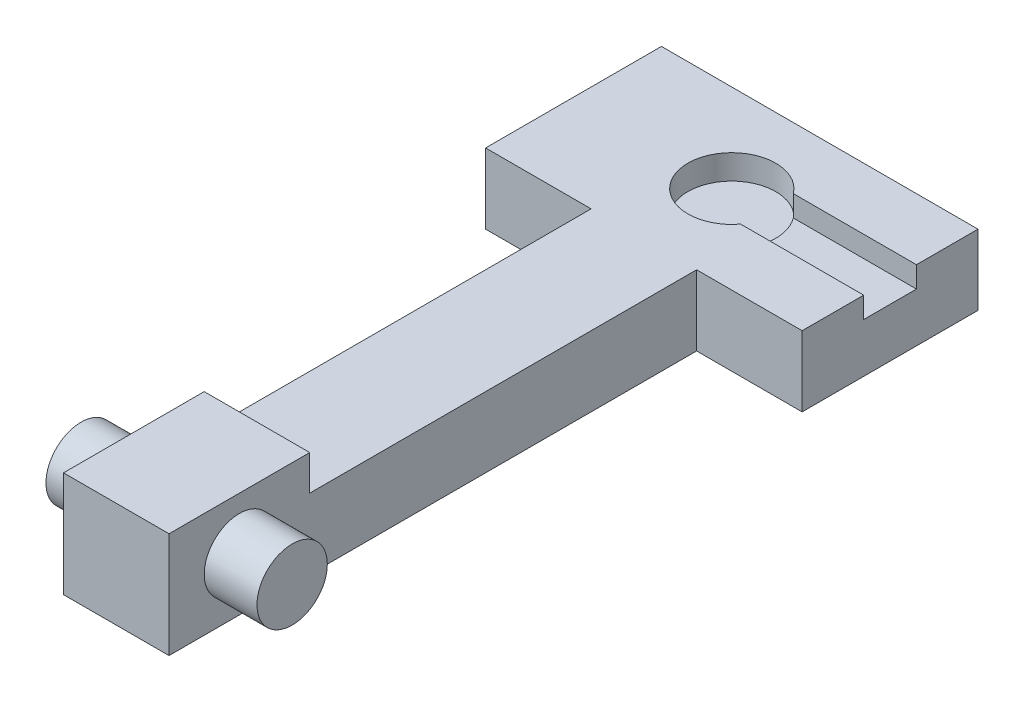
ISO-10303-21;
HEADER;
FILE_DESCRIPTION(('STEP AP214'),'2;1');
FILE_NAME('part.step','',(''),(''),'','','');
FILE_SCHEMA(('AUTOMOTIVE_DESIGN { 1 0 10303 214 1 1 1 1 }'));
ENDSEC;
DATA;
#1=APPLICATION_CONTEXT('core data for automotive mechanical design processes');
#2=APPLICATION_PROTOCOL_DEFINITION('international standard','automotive_design',2000,#1);
#3=PRODUCT_CONTEXT('',#1,'mechanical');
#4=PRODUCT('Part','Part','',(#3));
#5=PRODUCT_RELATED_PRODUCT_CATEGORY('part','',(#4));
#6=PRODUCT_DEFINITION_FORMATION('','',#4);
#7=PRODUCT_DEFINITION_CONTEXT('part definition',#1,'design');
#8=PRODUCT_DEFINITION('design','',#6,#7);
#9=PRODUCT_DEFINITION_SHAPE('','',#8);
#10=(LENGTH_UNIT() NAMED_UNIT(*) SI_UNIT(.MILLI.,.METRE.));
#11=(NAMED_UNIT(*) PLANE_ANGLE_UNIT() SI_UNIT($,.RADIAN.));
#12=(NAMED_UNIT(*) SI_UNIT($,.STERADIAN.) SOLID_ANGLE_UNIT());
#13=UNCERTAINTY_MEASURE_WITH_UNIT(LENGTH_MEASURE(1.E-05),#10,'distance_accuracy_value','');
#14=(GEOMETRIC_REPRESENTATION_CONTEXT(3) GLOBAL_UNCERTAINTY_ASSIGNED_CONTEXT((#13)) GLOBAL_UNIT_ASSIGNED_CONTEXT((#10,
#11,#12)) REPRESENTATION_CONTEXT('',''));
#15=CARTESIAN_POINT('',(0.,0.,0.));
#16=DIRECTION('',(0.,0.,1.));
#17=DIRECTION('',(1.,0.,0.));
#18=AXIS2_PLACEMENT_3D('',#15,#16,#17);
#19=CARTESIAN_POINT('',(0.,20.,0.));
#20=DIRECTION('',(1.,0.,0.));
#21=DIRECTION('',(0.,0.,-1.));
#22=AXIS2_PLACEMENT_3D('',#19,#20,#21);
#23=PLANE('',#22);
#24=CARTESIAN_POINT('',(0.,15.,-20.));
#25=DIRECTION('',(1.,0.,0.));
#26=DIRECTION('',(0.,0.,-1.));
#27=AXIS2_PLACEMENT_3D('',#24,#25,#26);
#28=CIRCLE('',#27,10.);
#29=CARTESIAN_POINT('',(0.,15.,-30.));
#30=VERTEX_POINT('',#29);
#31=EDGE_CURVE('E333',#30,#30,#28,.T.);
#32=ORIENTED_EDGE('',*,*,#31,.T.);
#33=EDGE_LOOP('',(#32));
#34=FACE_BOUND('',#33,.T.);
#35=DIRECTION('',(0.,0.,1.));
#36=VECTOR('',#35,1.);
#37=CARTESIAN_POINT('',(0.,0.,0.));
#38=LINE('',#37,#36);
#39=CARTESIAN_POINT('',(0.,0.,-150.));
#40=VERTEX_POINT('',#39);
#41=CARTESIAN_POINT('',(0.,0.,0.));
#42=VERTEX_POINT('',#41);
#43=EDGE_CURVE('E205',#40,#42,#38,.T.);
#44=ORIENTED_EDGE('',*,*,#43,.T.);
#45=DIRECTION('',(0.,-1.,0.));
#46=VECTOR('',#45,1.);
#47=CARTESIAN_POINT('',(0.,20.,0.));
#48=LINE('',#47,#46);
#49=CARTESIAN_POINT('',(0.,30.,0.));
#50=VERTEX_POINT('',#49);
#51=EDGE_CURVE('E282',#50,#42,#48,.T.);
#52=ORIENTED_EDGE('',*,*,#51,.F.);
#53=DIRECTION('',(0.,0.,1.));
#54=VECTOR('',#53,1.);
#55=CARTESIAN_POINT('',(0.,30.,0.));
#56=LINE('',#55,#54);
#57=CARTESIAN_POINT('',(0.,30.,-40.));
#58=VERTEX_POINT('',#57);
#59=EDGE_CURVE('E158',#58,#50,#56,.T.);
#60=ORIENTED_EDGE('',*,*,#59,.F.);
#61=DIRECTION('',(0.,-1.,0.));
#62=VECTOR('',#61,1.);
#63=CARTESIAN_POINT('',(0.,30.,-40.));
#64=LINE('',#63,#62);
#65=CARTESIAN_POINT('',(0.,20.,-40.));
#66=VERTEX_POINT('',#65);
#67=EDGE_CURVE('E153',#58,#66,#64,.T.);
#68=ORIENTED_EDGE('',*,*,#67,.T.);
#69=DIRECTION('',(0.,0.,1.));
#70=VECTOR('',#69,1.);
#71=CARTESIAN_POINT('',(0.,20.,0.));
#72=LINE('',#71,#70);
#73=CARTESIAN_POINT('',(0.,20.,-150.));
#74=VERTEX_POINT('',#73);
#75=EDGE_CURVE('E209',#74,#66,#72,.T.);
#76=ORIENTED_EDGE('',*,*,#75,.F.);
#77=DIRECTION('',(0.,-1.,0.));
#78=VECTOR('',#77,1.);
#79=CARTESIAN_POINT('',(0.,20.,-150.));
#80=LINE('',#79,#78);
#81=EDGE_CURVE('E232',#74,#40,#80,.T.);
#82=ORIENTED_EDGE('',*,*,#81,.T.);
#83=EDGE_LOOP('',(#44,#52,#60,#68,#76,#82));
#84=FACE_BOUND('',#83,.T.);
#85=ADVANCED_FACE('F45',(#34,#84),#23,.F.);
#86=CARTESIAN_POINT('',(0.,20.,0.));
#87=DIRECTION('',(0.,0.,-1.));
#88=DIRECTION('',(-1.,0.,0.));
#89=AXIS2_PLACEMENT_3D('',#86,#87,#88);
#90=PLANE('',#89);
#91=DIRECTION('',(1.,0.,0.));
#92=VECTOR('',#91,1.);
#93=CARTESIAN_POINT('',(0.,0.,0.));
#94=LINE('',#93,#92);
#95=CARTESIAN_POINT('',(30.,0.,0.));
#96=VERTEX_POINT('',#95);
#97=EDGE_CURVE('E236',#42,#96,#94,.T.);
#98=ORIENTED_EDGE('',*,*,#97,.T.);
#99=DIRECTION('',(0.,-1.,0.));
#100=VECTOR('',#99,1.);
#101=CARTESIAN_POINT('',(30.,20.,0.));
#102=LINE('',#101,#100);
#103=CARTESIAN_POINT('',(30.,30.,0.));
#104=VERTEX_POINT('',#103);
#105=EDGE_CURVE('E279',#104,#96,#102,.T.);
#106=ORIENTED_EDGE('',*,*,#105,.F.);
#107=DIRECTION('',(1.,0.,0.));
#108=VECTOR('',#107,1.);
#109=CARTESIAN_POINT('',(30.,30.,0.));
#110=LINE('',#109,#108);
#111=EDGE_CURVE('E165',#50,#104,#110,.T.);
#112=ORIENTED_EDGE('',*,*,#111,.F.);
#113=ORIENTED_EDGE('',*,*,#51,.T.);
#114=EDGE_LOOP('',(#98,#106,#112,#113));
#115=FACE_BOUND('',#114,.T.);
#116=ADVANCED_FACE('F323',(#115),#90,.F.);
#117=CARTESIAN_POINT('',(30.,20.,0.));
#118=DIRECTION('',(-1.,0.,0.));
#119=DIRECTION('',(0.,0.,1.));
#120=AXIS2_PLACEMENT_3D('',#117,#118,#119);
#121=PLANE('',#120);
#122=CARTESIAN_POINT('',(30.,15.,-20.));
#123=DIRECTION('',(-1.,0.,0.));
#124=DIRECTION('',(0.,0.,1.));
#125=AXIS2_PLACEMENT_3D('',#122,#123,#124);
#126=CIRCLE('',#125,10.);
#127=CARTESIAN_POINT('',(30.,15.,-30.));
#128=VERTEX_POINT('',#127);
#129=EDGE_CURVE('E48',#128,#128,#126,.T.);
#130=ORIENTED_EDGE('',*,*,#129,.T.);
#131=EDGE_LOOP('',(#130));
#132=FACE_BOUND('',#131,.T.);
#133=DIRECTION('',(0.,0.,-1.));
#134=VECTOR('',#133,1.);
#135=CARTESIAN_POINT('',(30.,0.,0.));
#136=LINE('',#135,#134);
#137=CARTESIAN_POINT('',(30.,0.,-150.));
#138=VERTEX_POINT('',#137);
#139=EDGE_CURVE('E239',#96,#138,#136,.T.);
#140=ORIENTED_EDGE('',*,*,#139,.T.);
#141=DIRECTION('',(0.,-1.,0.));
#142=VECTOR('',#141,1.);
#143=CARTESIAN_POINT('',(30.,20.,-150.));
#144=LINE('',#143,#142);
#145=CARTESIAN_POINT('',(30.,20.,-150.));
#146=VERTEX_POINT('',#145);
#147=EDGE_CURVE('E275',#146,#138,#144,.T.);
#148=ORIENTED_EDGE('',*,*,#147,.F.);
#149=DIRECTION('',(0.,0.,-1.));
#150=VECTOR('',#149,1.);
#151=CARTESIAN_POINT('',(30.,20.,0.));
#152=LINE('',#151,#150);
#153=CARTESIAN_POINT('',(30.,20.,-40.));
#154=VERTEX_POINT('',#153);
#155=EDGE_CURVE('E172',#154,#146,#152,.T.);
#156=ORIENTED_EDGE('',*,*,#155,.F.);
#157=DIRECTION('',(0.,-1.,0.));
#158=VECTOR('',#157,1.);
#159=CARTESIAN_POINT('',(30.,30.,-40.));
#160=LINE('',#159,#158);
#161=CARTESIAN_POINT('',(30.,30.,-40.));
#162=VERTEX_POINT('',#161);
#163=EDGE_CURVE('E151',#162,#154,#160,.T.);
#164=ORIENTED_EDGE('',*,*,#163,.F.);
#165=DIRECTION('',(0.,0.,-1.));
#166=VECTOR('',#165,1.);
#167=CARTESIAN_POINT('',(30.,30.,0.));
#168=LINE('',#167,#166);
#169=EDGE_CURVE('E159',#104,#162,#168,.T.);
#170=ORIENTED_EDGE('',*,*,#169,.F.);
#171=ORIENTED_EDGE('',*,*,#105,.T.);
#172=EDGE_LOOP('',(#140,#148,#156,#164,#170,#171));
#173=FACE_BOUND('',#172,.T.);
#174=ADVANCED_FACE('F170',(#132,#173),#121,.F.);
#175=CARTESIAN_POINT('',(60.,20.,-150.));
#176=DIRECTION('',(0.,0.,-1.));
#177=DIRECTION('',(-1.,0.,0.));
#178=AXIS2_PLACEMENT_3D('',#175,#176,#177);
#179=PLANE('',#178);
#180=DIRECTION('',(1.,0.,0.));
#181=VECTOR('',#180,1.);
#182=CARTESIAN_POINT('',(60.,0.,-150.));
#183=LINE('',#182,#181);
#184=CARTESIAN_POINT('',(60.,0.,-150.));
#185=VERTEX_POINT('',#184);
#186=EDGE_CURVE('E242',#138,#185,#183,.T.);
#187=ORIENTED_EDGE('',*,*,#186,.T.);
#188=DIRECTION('',(0.,-1.,0.));
#189=VECTOR('',#188,1.);
#190=CARTESIAN_POINT('',(60.,20.,-150.));
#191=LINE('',#190,#189);
#192=CARTESIAN_POINT('',(60.,20.,-150.));
#193=VERTEX_POINT('',#192);
#194=EDGE_CURVE('E271',#193,#185,#191,.T.);
#195=ORIENTED_EDGE('',*,*,#194,.F.);
#196=DIRECTION('',(1.,0.,0.));
#197=VECTOR('',#196,1.);
#198=CARTESIAN_POINT('',(60.,20.,-150.));
#199=LINE('',#198,#197);
#200=EDGE_CURVE('E215',#146,#193,#199,.T.);
#201=ORIENTED_EDGE('',*,*,#200,.F.);
#202=ORIENTED_EDGE('',*,*,#147,.T.);
#203=EDGE_LOOP('',(#187,#195,#201,#202));
#204=FACE_BOUND('',#203,.T.);
#205=ADVANCED_FACE('F371',(#204),#179,.F.);
#206=CARTESIAN_POINT('',(60.,20.,-200.));
#207=DIRECTION('',(-1.,0.,0.));
#208=DIRECTION('',(0.,0.,1.));
#209=AXIS2_PLACEMENT_3D('',#206,#207,#208);
#210=PLANE('',#209);
#211=DIRECTION('',(0.,0.,-1.));
#212=VECTOR('',#211,1.);
#213=CARTESIAN_POINT('',(60.,14.,-182.5));
#214=LINE('',#213,#212);
#215=CARTESIAN_POINT('',(60.,14.,-167.5));
#216=VERTEX_POINT('',#215);
#217=CARTESIAN_POINT('',(60.,14.,-182.5));
#218=VERTEX_POINT('',#217);
#219=EDGE_CURVE('E183',#216,#218,#214,.T.);
#220=ORIENTED_EDGE('',*,*,#219,.F.);
#221=DIRECTION('',(0.,1.,0.));
#222=VECTOR('',#221,1.);
#223=CARTESIAN_POINT('',(60.,14.,-167.5));
#224=LINE('',#223,#222);
#225=CARTESIAN_POINT('',(60.,20.,-167.5));
#226=VERTEX_POINT('',#225);
#227=EDGE_CURVE('E194',#216,#226,#224,.T.);
#228=ORIENTED_EDGE('',*,*,#227,.T.);
#229=DIRECTION('',(0.,0.,-1.));
#230=VECTOR('',#229,1.);
#231=CARTESIAN_POINT('',(60.,20.,-200.));
#232=LINE('',#231,#230);
#233=EDGE_CURVE('E219',#193,#226,#232,.T.);
#234=ORIENTED_EDGE('',*,*,#233,.F.);
#235=ORIENTED_EDGE('',*,*,#194,.T.);
#236=DIRECTION('',(0.,0.,-1.));
#237=VECTOR('',#236,1.);
#238=CARTESIAN_POINT('',(60.,0.,-200.));
#239=LINE('',#238,#237);
#240=CARTESIAN_POINT('',(60.,0.,-200.));
#241=VERTEX_POINT('',#240);
#242=EDGE_CURVE('E245',#185,#241,#239,.T.);
#243=ORIENTED_EDGE('',*,*,#242,.T.);
#244=DIRECTION('',(0.,-1.,0.));
#245=VECTOR('',#244,1.);
#246=CARTESIAN_POINT('',(60.,20.,-200.));
#247=LINE('',#246,#245);
#248=CARTESIAN_POINT('',(60.,20.,-200.));
#249=VERTEX_POINT('',#248);
#250=EDGE_CURVE('E267',#249,#241,#247,.T.);
#251=ORIENTED_EDGE('',*,*,#250,.F.);
#252=CARTESIAN_POINT('',(60.,20.,-182.5));
#253=VERTEX_POINT('',#252);
#254=EDGE_CURVE('E218',#253,#249,#232,.T.);
#255=ORIENTED_EDGE('',*,*,#254,.F.);
#256=DIRECTION('',(0.,1.,0.));
#257=VECTOR('',#256,1.);
#258=CARTESIAN_POINT('',(60.,14.,-182.5));
#259=LINE('',#258,#257);
#260=EDGE_CURVE('E190',#218,#253,#259,.T.);
#261=ORIENTED_EDGE('',*,*,#260,.F.);
#262=EDGE_LOOP('',(#220,#228,#234,#235,#243,#251,#255,#261));
#263=FACE_BOUND('',#262,.T.);
#264=ADVANCED_FACE('F308',(#263),#210,.F.);
#265=CARTESIAN_POINT('',(-30.,20.,-200.));
#266=DIRECTION('',(0.,0.,1.));
#267=DIRECTION('',(1.,0.,0.));
#268=AXIS2_PLACEMENT_3D('',#265,#266,#267);
#269=PLANE('',#268);
#270=DIRECTION('',(-1.,0.,0.));
#271=VECTOR('',#270,1.);
#272=CARTESIAN_POINT('',(-30.,0.,-200.));
#273=LINE('',#272,#271);
#274=CARTESIAN_POINT('',(-30.,0.,-200.));
#275=VERTEX_POINT('',#274);
#276=EDGE_CURVE('E248',#241,#275,#273,.T.);
#277=ORIENTED_EDGE('',*,*,#276,.T.);
#278=DIRECTION('',(0.,-1.,0.));
#279=VECTOR('',#278,1.);
#280=CARTESIAN_POINT('',(-30.,20.,-200.));
#281=LINE('',#280,#279);
#282=CARTESIAN_POINT('',(-30.,20.,-200.));
#283=VERTEX_POINT('',#282);
#284=EDGE_CURVE('E263',#283,#275,#281,.T.);
#285=ORIENTED_EDGE('',*,*,#284,.F.);
#286=DIRECTION('',(-1.,0.,0.));
#287=VECTOR('',#286,1.);
#288=CARTESIAN_POINT('',(-30.,20.,-200.));
#289=LINE('',#288,#287);
#290=EDGE_CURVE('E223',#249,#283,#289,.T.);
#291=ORIENTED_EDGE('',*,*,#290,.F.);
#292=ORIENTED_EDGE('',*,*,#250,.T.);
#293=EDGE_LOOP('',(#277,#285,#291,#292));
#294=FACE_BOUND('',#293,.T.);
#295=ADVANCED_FACE('F382',(#294),#269,.F.);
#296=CARTESIAN_POINT('',(-30.,20.,-150.));
#297=DIRECTION('',(1.,0.,0.));
#298=DIRECTION('',(0.,0.,-1.));
#299=AXIS2_PLACEMENT_3D('',#296,#297,#298);
#300=PLANE('',#299);
#301=DIRECTION('',(0.,0.,1.));
#302=VECTOR('',#301,1.);
#303=CARTESIAN_POINT('',(-30.,0.,-150.));
#304=LINE('',#303,#302);
#305=CARTESIAN_POINT('',(-30.,0.,-150.));
#306=VERTEX_POINT('',#305);
#307=EDGE_CURVE('E251',#275,#306,#304,.T.);
#308=ORIENTED_EDGE('',*,*,#307,.T.);
#309=DIRECTION('',(0.,-1.,0.));
#310=VECTOR('',#309,1.);
#311=CARTESIAN_POINT('',(-30.,20.,-150.));
#312=LINE('',#311,#310);
#313=CARTESIAN_POINT('',(-30.,20.,-150.));
#314=VERTEX_POINT('',#313);
#315=EDGE_CURVE('E259',#314,#306,#312,.T.);
#316=ORIENTED_EDGE('',*,*,#315,.F.);
#317=DIRECTION('',(0.,0.,1.));
#318=VECTOR('',#317,1.);
#319=CARTESIAN_POINT('',(-30.,20.,-150.));
#320=LINE('',#319,#318);
#321=EDGE_CURVE('E226',#283,#314,#320,.T.);
#322=ORIENTED_EDGE('',*,*,#321,.F.);
#323=ORIENTED_EDGE('',*,*,#284,.T.);
#324=EDGE_LOOP('',(#308,#316,#322,#323));
#325=FACE_BOUND('',#324,.T.);
#326=ADVANCED_FACE('F385',(#325),#300,.F.);
#327=CARTESIAN_POINT('',(0.,20.,-150.));
#328=DIRECTION('',(0.,0.,-1.));
#329=DIRECTION('',(-1.,0.,0.));
#330=AXIS2_PLACEMENT_3D('',#327,#328,#329);
#331=PLANE('',#330);
#332=DIRECTION('',(1.,0.,0.));
#333=VECTOR('',#332,1.);
#334=CARTESIAN_POINT('',(0.,0.,-150.));
#335=LINE('',#334,#333);
#336=EDGE_CURVE('E212',#306,#40,#335,.T.);
#337=ORIENTED_EDGE('',*,*,#336,.T.);
#338=ORIENTED_EDGE('',*,*,#81,.F.);
#339=DIRECTION('',(1.,0.,0.));
#340=VECTOR('',#339,1.);
#341=CARTESIAN_POINT('',(0.,20.,-150.));
#342=LINE('',#341,#340);
#343=EDGE_CURVE('E229',#314,#74,#342,.T.);
#344=ORIENTED_EDGE('',*,*,#343,.F.);
#345=ORIENTED_EDGE('',*,*,#315,.T.);
#346=EDGE_LOOP('',(#337,#338,#344,#345));
#347=FACE_BOUND('',#346,.T.);
#348=ADVANCED_FACE('F389',(#347),#331,.F.);
#349=CARTESIAN_POINT('',(0.,20.,0.));
#350=DIRECTION('',(0.,1.,0.));
#351=DIRECTION('',(0.,0.,1.));
#352=AXIS2_PLACEMENT_3D('',#349,#350,#351);
#353=PLANE('',#352);
#354=DIRECTION('',(-1.,0.,0.));
#355=VECTOR('',#354,1.);
#356=CARTESIAN_POINT('',(30.,20.,-40.));
#357=LINE('',#356,#355);
#358=EDGE_CURVE('E61',#154,#66,#357,.T.);
#359=ORIENTED_EDGE('',*,*,#358,.F.);
#360=ORIENTED_EDGE('',*,*,#155,.T.);
#361=ORIENTED_EDGE('',*,*,#200,.T.);
#362=ORIENTED_EDGE('',*,*,#233,.T.);
#363=DIRECTION('',(1.,0.,0.));
#364=VECTOR('',#363,1.);
#365=CARTESIAN_POINT('',(60.,20.,-167.5));
#366=LINE('',#365,#364);
#367=CARTESIAN_POINT('',(25.,20.,-167.5));
#368=VERTEX_POINT('',#367);
#369=EDGE_CURVE('E178',#368,#226,#366,.T.);
#370=ORIENTED_EDGE('',*,*,#369,.F.);
#371=CARTESIAN_POINT('',(15.,20.,-175.));
#372=DIRECTION('',(0.,1.,0.));
#373=DIRECTION('',(0.,0.,1.));
#374=AXIS2_PLACEMENT_3D('',#371,#372,#373);
#375=CIRCLE('',#374,12.5);
#376=CARTESIAN_POINT('',(25.,20.,-182.5));
#377=VERTEX_POINT('',#376);
#378=EDGE_CURVE('E198',#377,#368,#375,.T.);
#379=ORIENTED_EDGE('',*,*,#378,.F.);
#380=DIRECTION('',(-1.,0.,0.));
#381=VECTOR('',#380,1.);
#382=CARTESIAN_POINT('',(60.,20.,-182.5));
#383=LINE('',#382,#381);
#384=EDGE_CURVE('E174',#253,#377,#383,.T.);
#385=ORIENTED_EDGE('',*,*,#384,.F.);
#386=ORIENTED_EDGE('',*,*,#254,.T.);
#387=ORIENTED_EDGE('',*,*,#290,.T.);
#388=ORIENTED_EDGE('',*,*,#321,.T.);
#389=ORIENTED_EDGE('',*,*,#343,.T.);
#390=ORIENTED_EDGE('',*,*,#75,.T.);
#391=EDGE_LOOP('',(#359,#360,#361,#362,#370,#379,#385,#386,#387,#388,#389,#390));
#392=FACE_BOUND('',#391,.T.);
#393=ADVANCED_FACE('F299',(#392),#353,.T.);
#394=CARTESIAN_POINT('',(0.,0.,0.));
#395=DIRECTION('',(0.,1.,0.));
#396=DIRECTION('',(0.,0.,1.));
#397=AXIS2_PLACEMENT_3D('',#394,#395,#396);
#398=PLANE('',#397);
#399=ORIENTED_EDGE('',*,*,#43,.F.);
#400=ORIENTED_EDGE('',*,*,#336,.F.);
#401=ORIENTED_EDGE('',*,*,#307,.F.);
#402=ORIENTED_EDGE('',*,*,#276,.F.);
#403=ORIENTED_EDGE('',*,*,#242,.F.);
#404=ORIENTED_EDGE('',*,*,#186,.F.);
#405=ORIENTED_EDGE('',*,*,#139,.F.);
#406=ORIENTED_EDGE('',*,*,#97,.F.);
#407=EDGE_LOOP('',(#399,#400,#401,#402,#403,#404,#405,#406));
#408=FACE_BOUND('',#407,.T.);
#409=ADVANCED_FACE('F339',(#408),#398,.F.);
#410=CARTESIAN_POINT('',(15.,13.,-175.));
#411=DIRECTION('',(0.,1.,0.));
#412=DIRECTION('',(0.,0.,1.));
#413=AXIS2_PLACEMENT_3D('',#410,#411,#412);
#414=CYLINDRICAL_SURFACE('',#413,12.5);
#415=ORIENTED_EDGE('',*,*,#378,.T.);
#416=DIRECTION('',(0.,1.,0.));
#417=VECTOR('',#416,1.);
#418=CARTESIAN_POINT('',(25.,13.,-167.5));
#419=LINE('',#418,#417);
#420=CARTESIAN_POINT('',(25.,14.,-167.5));
#421=VERTEX_POINT('',#420);
#422=EDGE_CURVE('E11',#368,#421,#419,.F.);
#423=ORIENTED_EDGE('',*,*,#422,.T.);
#424=CARTESIAN_POINT('',(15.,14.,-175.));
#425=DIRECTION('',(0.,-1.,0.));
#426=DIRECTION('',(0.,0.,-1.));
#427=AXIS2_PLACEMENT_3D('',#424,#425,#426);
#428=CIRCLE('',#427,12.5);
#429=CARTESIAN_POINT('',(25.,14.,-182.5));
#430=VERTEX_POINT('',#429);
#431=EDGE_CURVE('E286',#421,#430,#428,.F.);
#432=ORIENTED_EDGE('',*,*,#431,.T.);
#433=DIRECTION('',(0.,1.,0.));
#434=VECTOR('',#433,1.);
#435=CARTESIAN_POINT('',(25.,13.,-182.5));
#436=LINE('',#435,#434);
#437=EDGE_CURVE('E54',#430,#377,#436,.T.);
#438=ORIENTED_EDGE('',*,*,#437,.T.);
#439=EDGE_LOOP('',(#415,#423,#432,#438));
#440=FACE_BOUND('',#439,.T.);
#441=CARTESIAN_POINT('',(15.,13.,-175.));
#442=DIRECTION('',(0.,1.,0.));
#443=DIRECTION('',(0.,0.,1.));
#444=AXIS2_PLACEMENT_3D('',#441,#442,#443);
#445=CIRCLE('',#444,12.5);
#446=CARTESIAN_POINT('',(15.,13.,-162.5));
#447=VERTEX_POINT('',#446);
#448=EDGE_CURVE('E201',#447,#447,#445,.T.);
#449=ORIENTED_EDGE('',*,*,#448,.F.);
#450=EDGE_LOOP('',(#449));
#451=FACE_BOUND('',#450,.T.);
#452=ADVANCED_FACE('F294',(#440,#451),#414,.F.);
#453=CARTESIAN_POINT('',(15.,13.,-175.));
#454=DIRECTION('',(0.,1.,0.));
#455=DIRECTION('',(0.,0.,1.));
#456=AXIS2_PLACEMENT_3D('',#453,#454,#455);
#457=PLANE('',#456);
#458=ORIENTED_EDGE('',*,*,#448,.T.);
#459=EDGE_LOOP('',(#458));
#460=FACE_BOUND('',#459,.T.);
#461=ADVANCED_FACE('F400',(#460),#457,.T.);
#462=CARTESIAN_POINT('',(60.,14.,-167.5));
#463=DIRECTION('',(0.,0.,1.));
#464=DIRECTION('',(1.,0.,0.));
#465=AXIS2_PLACEMENT_3D('',#462,#463,#464);
#466=PLANE('',#465);
#467=ORIENTED_EDGE('',*,*,#369,.T.);
#468=ORIENTED_EDGE('',*,*,#227,.F.);
#469=DIRECTION('',(1.,0.,0.));
#470=VECTOR('',#469,1.);
#471=CARTESIAN_POINT('',(60.,14.,-167.5));
#472=LINE('',#471,#470);
#473=EDGE_CURVE('E188',#421,#216,#472,.T.);
#474=ORIENTED_EDGE('',*,*,#473,.F.);
#475=ORIENTED_EDGE('',*,*,#422,.F.);
#476=EDGE_LOOP('',(#467,#468,#474,#475));
#477=FACE_BOUND('',#476,.T.);
#478=ADVANCED_FACE('F304',(#477),#466,.F.);
#479=CARTESIAN_POINT('',(60.,14.,-182.5));
#480=DIRECTION('',(0.,0.,-1.));
#481=DIRECTION('',(-1.,0.,0.));
#482=AXIS2_PLACEMENT_3D('',#479,#480,#481);
#483=PLANE('',#482);
#484=DIRECTION('',(-1.,0.,0.));
#485=VECTOR('',#484,1.);
#486=CARTESIAN_POINT('',(60.,14.,-182.5));
#487=LINE('',#486,#485);
#488=EDGE_CURVE('E69',#218,#430,#487,.T.);
#489=ORIENTED_EDGE('',*,*,#488,.F.);
#490=ORIENTED_EDGE('',*,*,#260,.T.);
#491=ORIENTED_EDGE('',*,*,#384,.T.);
#492=ORIENTED_EDGE('',*,*,#437,.F.);
#493=EDGE_LOOP('',(#489,#490,#491,#492));
#494=FACE_BOUND('',#493,.T.);
#495=ADVANCED_FACE('F312',(#494),#483,.F.);
#496=CARTESIAN_POINT('',(0.,14.,0.));
#497=DIRECTION('',(0.,-1.,0.));
#498=DIRECTION('',(0.,0.,-1.));
#499=AXIS2_PLACEMENT_3D('',#496,#497,#498);
#500=PLANE('',#499);
#501=ORIENTED_EDGE('',*,*,#473,.T.);
#502=ORIENTED_EDGE('',*,*,#219,.T.);
#503=ORIENTED_EDGE('',*,*,#488,.T.);
#504=ORIENTED_EDGE('',*,*,#431,.F.);
#505=EDGE_LOOP('',(#501,#502,#503,#504));
#506=FACE_BOUND('',#505,.T.);
#507=ADVANCED_FACE('F310',(#506),#500,.F.);
#508=CARTESIAN_POINT('',(30.,30.,-40.));
#509=DIRECTION('',(0.,0.,1.));
#510=DIRECTION('',(1.,0.,0.));
#511=AXIS2_PLACEMENT_3D('',#508,#509,#510);
#512=PLANE('',#511);
#513=ORIENTED_EDGE('',*,*,#358,.T.);
#514=ORIENTED_EDGE('',*,*,#67,.F.);
#515=DIRECTION('',(-1.,0.,0.));
#516=VECTOR('',#515,1.);
#517=CARTESIAN_POINT('',(30.,30.,-40.));
#518=LINE('',#517,#516);
#519=EDGE_CURVE('E147',#162,#58,#518,.T.);
#520=ORIENTED_EDGE('',*,*,#519,.F.);
#521=ORIENTED_EDGE('',*,*,#163,.T.);
#522=EDGE_LOOP('',(#513,#514,#520,#521));
#523=FACE_BOUND('',#522,.T.);
#524=ADVANCED_FACE('F149',(#523),#512,.F.);
#525=CARTESIAN_POINT('',(0.,30.,0.));
#526=DIRECTION('',(0.,1.,0.));
#527=DIRECTION('',(0.,0.,1.));
#528=AXIS2_PLACEMENT_3D('',#525,#526,#527);
#529=PLANE('',#528);
#530=ORIENTED_EDGE('',*,*,#169,.T.);
#531=ORIENTED_EDGE('',*,*,#519,.T.);
#532=ORIENTED_EDGE('',*,*,#59,.T.);
#533=ORIENTED_EDGE('',*,*,#111,.T.);
#534=EDGE_LOOP('',(#530,#531,#532,#533));
#535=FACE_BOUND('',#534,.T.);
#536=ADVANCED_FACE('F163',(#535),#529,.T.);
#537=CARTESIAN_POINT('',(45.,15.,-20.));
#538=DIRECTION('',(1.,0.,0.));
#539=DIRECTION('',(0.,0.,-1.));
#540=AXIS2_PLACEMENT_3D('',#537,#538,#539);
#541=PLANE('',#540);
#542=CARTESIAN_POINT('',(45.,15.,-20.));
#543=DIRECTION('',(1.,0.,0.));
#544=DIRECTION('',(0.,0.,-1.));
#545=AXIS2_PLACEMENT_3D('',#542,#543,#544);
#546=CIRCLE('',#545,10.);
#547=CARTESIAN_POINT('',(45.,15.,-30.));
#548=VERTEX_POINT('',#547);
#549=EDGE_CURVE('E357',#548,#548,#546,.T.);
#550=ORIENTED_EDGE('',*,*,#549,.T.);
#551=EDGE_LOOP('',(#550));
#552=FACE_BOUND('',#551,.T.);
#553=ADVANCED_FACE('F362',(#552),#541,.T.);
#554=CARTESIAN_POINT('',(-15.,15.,-20.));
#555=DIRECTION('',(1.,0.,0.));
#556=DIRECTION('',(0.,0.,-1.));
#557=AXIS2_PLACEMENT_3D('',#554,#555,#556);
#558=CYLINDRICAL_SURFACE('',#557,10.);
#559=CARTESIAN_POINT('',(45.,15.,-30.));
#560=CARTESIAN_POINT('',(44.84375,15.,-30.));
#561=CARTESIAN_POINT('',(44.6875,15.,-30.));
#562=CARTESIAN_POINT('',(44.375,15.,-30.));
#563=CARTESIAN_POINT('',(44.21875,15.,-30.));
#564=CARTESIAN_POINT('',(43.90625,15.,-30.));
#565=CARTESIAN_POINT('',(43.75,15.,-30.));
#566=CARTESIAN_POINT('',(43.4375,15.,-30.));
#567=CARTESIAN_POINT('',(43.28125,15.,-30.));
#568=CARTESIAN_POINT('',(42.96875,15.,-30.));
#569=CARTESIAN_POINT('',(42.8125,15.,-30.));
#570=CARTESIAN_POINT('',(42.5,15.,-30.));
#571=CARTESIAN_POINT('',(42.34375,15.,-30.));
#572=CARTESIAN_POINT('',(42.03125,15.,-30.));
#573=CARTESIAN_POINT('',(41.875,15.,-30.));
#574=CARTESIAN_POINT('',(41.5625,15.,-30.));
#575=CARTESIAN_POINT('',(41.40625,15.,-30.));
#576=CARTESIAN_POINT('',(41.09375,15.,-30.));
#577=CARTESIAN_POINT('',(40.9375,15.,-30.));
#578=CARTESIAN_POINT('',(40.625,15.,-30.));
#579=CARTESIAN_POINT('',(40.46875,15.,-30.));
#580=CARTESIAN_POINT('',(40.15625,15.,-30.));
#581=CARTESIAN_POINT('',(40.,15.,-30.));
#582=CARTESIAN_POINT('',(39.6875,15.,-30.));
#583=CARTESIAN_POINT('',(39.53125,15.,-30.));
#584=CARTESIAN_POINT('',(39.21875,15.,-30.));
#585=CARTESIAN_POINT('',(39.0625,15.,-30.));
#586=CARTESIAN_POINT('',(38.75,15.,-30.));
#587=CARTESIAN_POINT('',(38.59375,15.,-30.));
#588=CARTESIAN_POINT('',(38.28125,15.,-30.));
#589=CARTESIAN_POINT('',(38.125,15.,-30.));
#590=CARTESIAN_POINT('',(37.8125,15.,-30.));
#591=CARTESIAN_POINT('',(37.65625,15.,-30.));
#592=CARTESIAN_POINT('',(37.34375,15.,-30.));
#593=CARTESIAN_POINT('',(37.1875,15.,-30.));
#594=CARTESIAN_POINT('',(36.875,15.,-30.));
#595=CARTESIAN_POINT('',(36.71875,15.,-30.));
#596=CARTESIAN_POINT('',(36.40625,15.,-30.));
#597=CARTESIAN_POINT('',(36.25,15.,-30.));
#598=CARTESIAN_POINT('',(35.9375,15.,-30.));
#599=CARTESIAN_POINT('',(35.78125,15.,-30.));
#600=CARTESIAN_POINT('',(35.46875,15.,-30.));
#601=CARTESIAN_POINT('',(35.3125,15.,-30.));
#602=CARTESIAN_POINT('',(35.,15.,-30.));
#603=CARTESIAN_POINT('',(34.84375,15.,-30.));
#604=CARTESIAN_POINT('',(34.53125,15.,-30.));
#605=CARTESIAN_POINT('',(34.375,15.,-30.));
#606=CARTESIAN_POINT('',(34.0625,15.,-30.));
#607=CARTESIAN_POINT('',(33.90625,15.,-30.));
#608=CARTESIAN_POINT('',(33.59375,15.,-30.));
#609=CARTESIAN_POINT('',(33.4375,15.,-30.));
#610=CARTESIAN_POINT('',(33.125,15.,-30.));
#611=CARTESIAN_POINT('',(32.96875,15.,-30.));
#612=CARTESIAN_POINT('',(32.65625,15.,-30.));
#613=CARTESIAN_POINT('',(32.5,15.,-30.));
#614=CARTESIAN_POINT('',(32.1875,15.,-30.));
#615=CARTESIAN_POINT('',(32.03125,15.,-30.));
#616=CARTESIAN_POINT('',(31.71875,15.,-30.));
#617=CARTESIAN_POINT('',(31.5625,15.,-30.));
#618=CARTESIAN_POINT('',(31.25,15.,-30.));
#619=CARTESIAN_POINT('',(31.09375,15.,-30.));
#620=CARTESIAN_POINT('',(30.78125,15.,-30.));
#621=CARTESIAN_POINT('',(30.625,15.,-30.));
#622=CARTESIAN_POINT('',(30.3125,15.,-30.));
#623=CARTESIAN_POINT('',(30.15625,15.,-30.));
#624=CARTESIAN_POINT('',(30.,15.,-30.));
#625=B_SPLINE_CURVE_WITH_KNOTS('',3,(#559,#560,#561,#562,#563,#564,#565,#566,#567,#568,#569,
#570,#571,#572,#573,#574,#575,#576,#577,#578,#579,#580,#581,#582,#583,#584,#585,#586,#587,#588,
#589,#590,#591,#592,#593,#594,#595,#596,#597,#598,#599,#600,#601,#602,#603,#604,#605,#606,#607,
#608,#609,#610,#611,#612,#613,#614,#615,#616,#617,#618,#619,#620,#621,#622,#623,#624),
.UNSPECIFIED.,.F.,.F.,(4,2,2,2,2,2,2,2,2,2,2,2,2,2,2,2,2,2,2,2,2,2,2,2,2,2,2,2,2,2,2,2,4),(0.,
0.468749999999997,0.937500000000001,1.40625,1.875,2.34375,2.8125,3.28125,3.75,4.21874999999999,
4.6875,5.15624999999999,5.62499999999999,6.09374999999999,6.56249999999999,7.03125,
7.49999999999999,7.96875,8.43749999999999,8.90624999999999,9.37499999999999,9.84374999999999,
10.3125,10.78125,11.25,11.71875,12.1875,12.65625,13.125,13.59375,14.0625,14.53125,15.),.UNSPECIFIED.);
#626=EDGE_CURVE('BSEAM364',#548,#128,#625,.T.);
#627=ORIENTED_EDGE('',*,*,#549,.F.);
#628=ORIENTED_EDGE('',*,*,#129,.F.);
#629=ORIENTED_EDGE('',*,*,#626,.T.);
#630=ORIENTED_EDGE('',*,*,#626,.F.);
#631=EDGE_LOOP('',(#627,#629,#628,#630));
#632=FACE_BOUND('',#631,.T.);
#633=ADVANCED_FACE('F364',(#632),#558,.T.);
#634=CARTESIAN_POINT('',(-15.,15.,-20.));
#635=DIRECTION('',(1.,0.,0.));
#636=DIRECTION('',(0.,0.,-1.));
#637=AXIS2_PLACEMENT_3D('',#634,#635,#636);
#638=CIRCLE('',#637,10.);
#639=CARTESIAN_POINT('',(-15.,15.,-30.));
#640=VERTEX_POINT('',#639);
#641=EDGE_CURVE('E352',#640,#640,#638,.T.);
#642=CARTESIAN_POINT('',(-15.,15.,-30.));
#643=CARTESIAN_POINT('',(-14.84375,15.,-30.));
#644=CARTESIAN_POINT('',(-14.6875,15.,-30.));
#645=CARTESIAN_POINT('',(-14.375,15.,-30.));
#646=CARTESIAN_POINT('',(-14.21875,15.,-30.));
#647=CARTESIAN_POINT('',(-13.90625,15.,-30.));
#648=CARTESIAN_POINT('',(-13.75,15.,-30.));
#649=CARTESIAN_POINT('',(-13.4375,15.,-30.));
#650=CARTESIAN_POINT('',(-13.28125,15.,-30.));
#651=CARTESIAN_POINT('',(-12.96875,15.,-30.));
#652=CARTESIAN_POINT('',(-12.8125,15.,-30.));
#653=CARTESIAN_POINT('',(-12.5,15.,-30.));
#654=CARTESIAN_POINT('',(-12.34375,15.,-30.));
#655=CARTESIAN_POINT('',(-12.03125,15.,-30.));
#656=CARTESIAN_POINT('',(-11.875,15.,-30.));
#657=CARTESIAN_POINT('',(-11.5625,15.,-30.));
#658=CARTESIAN_POINT('',(-11.40625,15.,-30.));
#659=CARTESIAN_POINT('',(-11.09375,15.,-30.));
#660=CARTESIAN_POINT('',(-10.9375,15.,-30.));
#661=CARTESIAN_POINT('',(-10.625,15.,-30.));
#662=CARTESIAN_POINT('',(-10.46875,15.,-30.));
#663=CARTESIAN_POINT('',(-10.15625,15.,-30.));
#664=CARTESIAN_POINT('',(-10.,15.,-30.));
#665=CARTESIAN_POINT('',(-9.6875,15.,-30.));
#666=CARTESIAN_POINT('',(-9.53125,15.,-30.));
#667=CARTESIAN_POINT('',(-9.21875,15.,-30.));
#668=CARTESIAN_POINT('',(-9.0625,15.,-30.));
#669=CARTESIAN_POINT('',(-8.75,15.,-30.));
#670=CARTESIAN_POINT('',(-8.59375,15.,-30.));
#671=CARTESIAN_POINT('',(-8.28125,15.,-30.));
#672=CARTESIAN_POINT('',(-8.125,15.,-30.));
#673=CARTESIAN_POINT('',(-7.8125,15.,-30.));
#674=CARTESIAN_POINT('',(-7.65625,15.,-30.));
#675=CARTESIAN_POINT('',(-7.34375,15.,-30.));
#676=CARTESIAN_POINT('',(-7.1875,15.,-30.));
#677=CARTESIAN_POINT('',(-6.875,15.,-30.));
#678=CARTESIAN_POINT('',(-6.71875,15.,-30.));
#679=CARTESIAN_POINT('',(-6.40625,15.,-30.));
#680=CARTESIAN_POINT('',(-6.25,15.,-30.));
#681=CARTESIAN_POINT('',(-5.9375,15.,-30.));
#682=CARTESIAN_POINT('',(-5.78125,15.,-30.));
#683=CARTESIAN_POINT('',(-5.46875,15.,-30.));
#684=CARTESIAN_POINT('',(-5.3125,15.,-30.));
#685=CARTESIAN_POINT('',(-5.,15.,-30.));
#686=CARTESIAN_POINT('',(-4.84375,15.,-30.));
#687=CARTESIAN_POINT('',(-4.53125,15.,-30.));
#688=CARTESIAN_POINT('',(-4.375,15.,-30.));
#689=CARTESIAN_POINT('',(-4.0625,15.,-30.));
#690=CARTESIAN_POINT('',(-3.90625,15.,-30.));
#691=CARTESIAN_POINT('',(-3.59375,15.,-30.));
#692=CARTESIAN_POINT('',(-3.4375,15.,-30.));
#693=CARTESIAN_POINT('',(-3.125,15.,-30.));
#694=CARTESIAN_POINT('',(-2.96875,15.,-30.));
#695=CARTESIAN_POINT('',(-2.65625,15.,-30.));
#696=CARTESIAN_POINT('',(-2.5,15.,-30.));
#697=CARTESIAN_POINT('',(-2.1875,15.,-30.));
#698=CARTESIAN_POINT('',(-2.03125,15.,-30.));
#699=CARTESIAN_POINT('',(-1.71875,15.,-30.));
#700=CARTESIAN_POINT('',(-1.5625,15.,-30.));
#701=CARTESIAN_POINT('',(-1.25,15.,-30.));
#702=CARTESIAN_POINT('',(-1.09375,15.,-30.));
#703=CARTESIAN_POINT('',(-0.781250000000002,15.,-30.));
#704=CARTESIAN_POINT('',(-0.625000000000002,15.,-30.));
#705=CARTESIAN_POINT('',(-0.312500000000002,15.,-30.));
#706=CARTESIAN_POINT('',(-0.156250000000002,15.,-30.));
#707=CARTESIAN_POINT('',(0.,15.,-30.));
#708=B_SPLINE_CURVE_WITH_KNOTS('',3,(#642,#643,#644,#645,#646,#647,#648,#649,#650,#651,#652,
#653,#654,#655,#656,#657,#658,#659,#660,#661,#662,#663,#664,#665,#666,#667,#668,#669,#670,#671,
#672,#673,#674,#675,#676,#677,#678,#679,#680,#681,#682,#683,#684,#685,#686,#687,#688,#689,#690,
#691,#692,#693,#694,#695,#696,#697,#698,#699,#700,#701,#702,#703,#704,#705,#706,#707),
.UNSPECIFIED.,.F.,.F.,(4,2,2,2,2,2,2,2,2,2,2,2,2,2,2,2,2,2,2,2,2,2,2,2,2,2,2,2,2,2,2,2,4),(0.,
0.468749999999999,0.937499999999999,1.40625,1.875,2.34375,2.8125,3.28125,3.75,4.21875,4.6875,
5.15625,5.625,6.09375,6.5625,7.03125,7.5,7.96875,8.4375,8.90625,9.375,9.84375,10.3125,10.78125,
11.25,11.71875,12.1875,12.65625,13.125,13.59375,14.0625,14.53125,15.),.UNSPECIFIED.);
#709=EDGE_CURVE('BSEAM367',#640,#30,#708,.T.);
#710=ORIENTED_EDGE('',*,*,#641,.T.);
#711=ORIENTED_EDGE('',*,*,#31,.F.);
#712=ORIENTED_EDGE('',*,*,#709,.T.);
#713=ORIENTED_EDGE('',*,*,#709,.F.);
#714=EDGE_LOOP('',(#710,#712,#711,#713));
#715=FACE_BOUND('',#714,.T.);
#716=ADVANCED_FACE('F367',(#715),#558,.T.);
#717=CARTESIAN_POINT('',(-15.,15.,-20.));
#718=DIRECTION('',(1.,0.,0.));
#719=DIRECTION('',(0.,0.,-1.));
#720=AXIS2_PLACEMENT_3D('',#717,#718,#719);
#721=PLANE('',#720);
#722=ORIENTED_EDGE('',*,*,#641,.F.);
#723=EDGE_LOOP('',(#722));
#724=FACE_BOUND('',#723,.T.);
#725=ADVANCED_FACE('F475',(#724),#721,.F.);
#726=CLOSED_SHELL('',(#85,#116,#174,#205,#264,#295,#326,#348,#393,#409,#452,#461,#478,#495,#507,
#524,#536,#553,#633,#716,#725));
#727=MANIFOLD_SOLID_BREP('B2',#726);
#728=ADVANCED_BREP_SHAPE_REPRESENTATION('',(#18,#727),#14);
#729=SHAPE_DEFINITION_REPRESENTATION(#9,#728);
ENDSEC;
END-ISO-10303-21;
